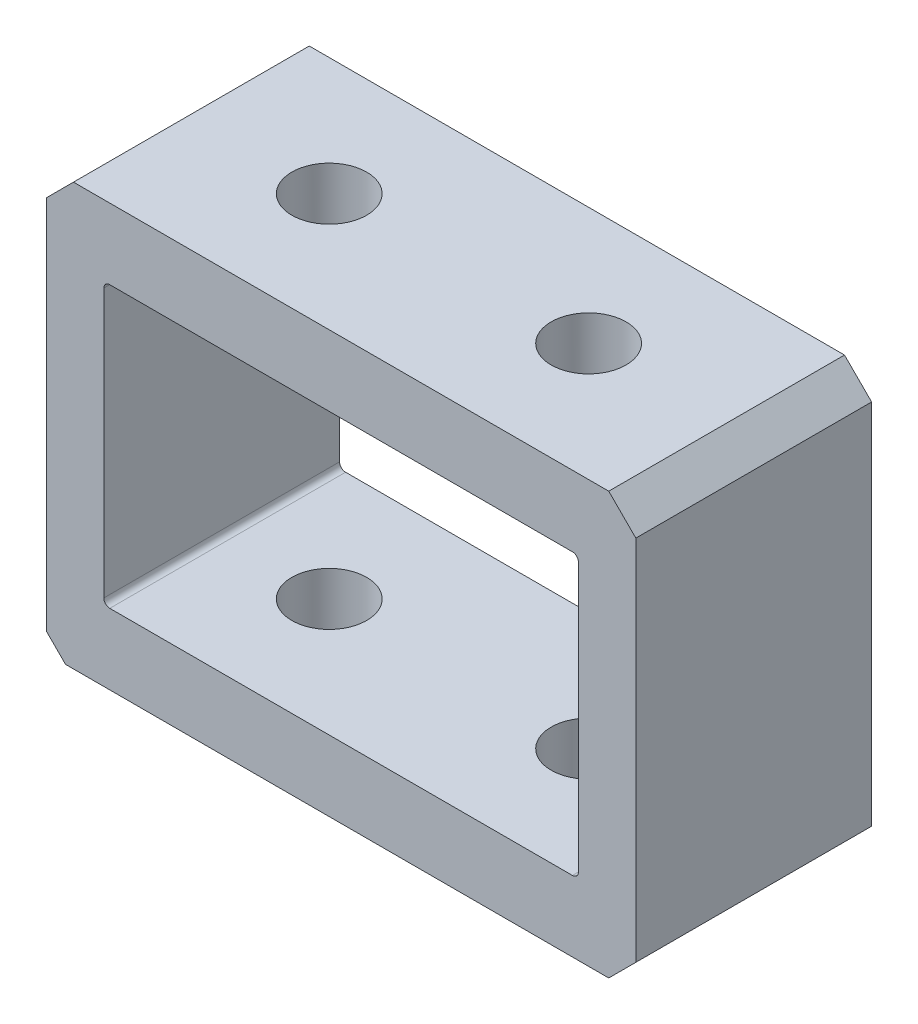
ISO-10303-21;
HEADER;
FILE_DESCRIPTION(('STEP AP214'),'2;1');
FILE_NAME('part.step','',(''),(''),'','','');
FILE_SCHEMA(('AUTOMOTIVE_DESIGN { 1 0 10303 214 1 1 1 1 }'));
ENDSEC;
DATA;
#1=APPLICATION_CONTEXT('core data for automotive mechanical design processes');
#2=APPLICATION_PROTOCOL_DEFINITION('international standard','automotive_design',2000,#1);
#3=PRODUCT_CONTEXT('',#1,'mechanical');
#4=PRODUCT('Part','Part','',(#3));
#5=PRODUCT_RELATED_PRODUCT_CATEGORY('part','',(#4));
#6=PRODUCT_DEFINITION_FORMATION('','',#4);
#7=PRODUCT_DEFINITION_CONTEXT('part definition',#1,'design');
#8=PRODUCT_DEFINITION('design','',#6,#7);
#9=PRODUCT_DEFINITION_SHAPE('','',#8);
#10=(LENGTH_UNIT() NAMED_UNIT(*) SI_UNIT(.MILLI.,.METRE.));
#11=(NAMED_UNIT(*) PLANE_ANGLE_UNIT() SI_UNIT($,.RADIAN.));
#12=(NAMED_UNIT(*) SI_UNIT($,.STERADIAN.) SOLID_ANGLE_UNIT());
#13=UNCERTAINTY_MEASURE_WITH_UNIT(LENGTH_MEASURE(1.E-05),#10,'distance_accuracy_value','');
#14=(GEOMETRIC_REPRESENTATION_CONTEXT(3) GLOBAL_UNCERTAINTY_ASSIGNED_CONTEXT((#13)) GLOBAL_UNIT_ASSIGNED_CONTEXT((#10,
#11,#12)) REPRESENTATION_CONTEXT('',''));
#15=CARTESIAN_POINT('',(0.,0.,0.));
#16=DIRECTION('',(0.,0.,1.));
#17=DIRECTION('',(1.,0.,0.));
#18=AXIS2_PLACEMENT_3D('',#15,#16,#17);
#19=CARTESIAN_POINT('',(-12.5,8.9408,10.));
#20=DIRECTION('',(0.,-1.,0.));
#21=DIRECTION('',(0.,0.,-1.));
#22=AXIS2_PLACEMENT_3D('',#19,#20,#21);
#23=PLANE('',#22);
#24=CARTESIAN_POINT('',(-5.50318075502607,8.9408,5.));
#25=DIRECTION('',(0.,-1.,0.));
#26=DIRECTION('',(0.,0.,-1.));
#27=AXIS2_PLACEMENT_3D('',#24,#25,#26);
#28=CIRCLE('',#27,1.5875);
#29=CARTESIAN_POINT('',(-5.50318075502607,8.9408,3.4125));
#30=VERTEX_POINT('',#29);
#31=EDGE_CURVE('E267',#30,#30,#28,.T.);
#32=ORIENTED_EDGE('',*,*,#31,.T.);
#33=EDGE_LOOP('',(#32));
#34=FACE_BOUND('',#33,.T.);
#35=DIRECTION('',(-1.,0.,0.));
#36=VECTOR('',#35,1.);
#37=CARTESIAN_POINT('',(-12.5,8.9408,10.));
#38=LINE('',#37,#36);
#39=CARTESIAN_POINT('',(11.3505,8.9408,10.));
#40=VERTEX_POINT('',#39);
#41=CARTESIAN_POINT('',(-11.3505,8.9408,10.));
#42=VERTEX_POINT('',#41);
#43=EDGE_CURVE('E298',#40,#42,#38,.T.);
#44=ORIENTED_EDGE('',*,*,#43,.F.);
#45=DIRECTION('',(0.,0.,-1.));
#46=VECTOR('',#45,1.);
#47=CARTESIAN_POINT('',(11.3505,8.9408,10.));
#48=LINE('',#47,#46);
#49=CARTESIAN_POINT('',(11.3505,8.9408,0.));
#50=VERTEX_POINT('',#49);
#51=EDGE_CURVE('E200',#40,#50,#48,.T.);
#52=ORIENTED_EDGE('',*,*,#51,.T.);
#53=DIRECTION('',(-1.,0.,0.));
#54=VECTOR('',#53,1.);
#55=CARTESIAN_POINT('',(-12.5,8.9408,0.));
#56=LINE('',#55,#54);
#57=CARTESIAN_POINT('',(-11.3505,8.9408,0.));
#58=VERTEX_POINT('',#57);
#59=EDGE_CURVE('E168',#50,#58,#56,.T.);
#60=ORIENTED_EDGE('',*,*,#59,.T.);
#61=DIRECTION('',(0.,0.,1.));
#62=VECTOR('',#61,1.);
#63=CARTESIAN_POINT('',(-11.3505,8.9408,10.));
#64=LINE('',#63,#62);
#65=EDGE_CURVE('E195',#58,#42,#64,.T.);
#66=ORIENTED_EDGE('',*,*,#65,.T.);
#67=EDGE_LOOP('',(#44,#52,#60,#66));
#68=FACE_BOUND('',#67,.T.);
#69=CARTESIAN_POINT('',(5.49681924497393,8.9408,5.));
#70=DIRECTION('',(0.,-1.,0.));
#71=DIRECTION('',(0.,0.,-1.));
#72=AXIS2_PLACEMENT_3D('',#69,#70,#71);
#73=CIRCLE('',#72,1.5875);
#74=CARTESIAN_POINT('',(5.49681924497393,8.9408,3.4125));
#75=VERTEX_POINT('',#74);
#76=EDGE_CURVE('E251',#75,#75,#73,.F.);
#77=ORIENTED_EDGE('',*,*,#76,.F.);
#78=EDGE_LOOP('',(#77));
#79=FACE_BOUND('',#78,.T.);
#80=ADVANCED_FACE('F40',(#34,#68,#79),#23,.F.);
#81=CARTESIAN_POINT('',(-12.5,-8.9408,10.));
#82=DIRECTION('',(0.,1.,0.));
#83=DIRECTION('',(0.,0.,1.));
#84=AXIS2_PLACEMENT_3D('',#81,#82,#83);
#85=PLANE('',#84);
#86=CARTESIAN_POINT('',(-5.50318075502607,-8.9408,5.));
#87=DIRECTION('',(0.,-1.,0.));
#88=DIRECTION('',(0.,0.,-1.));
#89=AXIS2_PLACEMENT_3D('',#86,#87,#88);
#90=CIRCLE('',#89,1.5875);
#91=CARTESIAN_POINT('',(-5.50318075502607,-8.9408,3.4125));
#92=VERTEX_POINT('',#91);
#93=EDGE_CURVE('E262',#92,#92,#90,.T.);
#94=ORIENTED_EDGE('',*,*,#93,.F.);
#95=EDGE_LOOP('',(#94));
#96=FACE_BOUND('',#95,.T.);
#97=DIRECTION('',(1.,0.,0.));
#98=VECTOR('',#97,1.);
#99=CARTESIAN_POINT('',(-12.5,-8.9408,0.));
#100=LINE('',#99,#98);
#101=CARTESIAN_POINT('',(-11.6871807550261,-8.9408,0.));
#102=VERTEX_POINT('',#101);
#103=CARTESIAN_POINT('',(11.3505,-8.9408,0.));
#104=VERTEX_POINT('',#103);
#105=EDGE_CURVE('E167',#102,#104,#100,.T.);
#106=ORIENTED_EDGE('',*,*,#105,.T.);
#107=DIRECTION('',(0.,0.,1.));
#108=VECTOR('',#107,1.);
#109=CARTESIAN_POINT('',(11.3505,-8.9408,10.));
#110=LINE('',#109,#108);
#111=CARTESIAN_POINT('',(11.3505,-8.9408,10.));
#112=VERTEX_POINT('',#111);
#113=EDGE_CURVE('E216',#104,#112,#110,.T.);
#114=ORIENTED_EDGE('',*,*,#113,.T.);
#115=DIRECTION('',(1.,0.,0.));
#116=VECTOR('',#115,1.);
#117=CARTESIAN_POINT('',(-12.5,-8.9408,10.));
#118=LINE('',#117,#116);
#119=CARTESIAN_POINT('',(-11.6871807550261,-8.9408,10.));
#120=VERTEX_POINT('',#119);
#121=EDGE_CURVE('E183',#120,#112,#118,.T.);
#122=ORIENTED_EDGE('',*,*,#121,.F.);
#123=DIRECTION('',(0.,0.,-1.));
#124=VECTOR('',#123,1.);
#125=CARTESIAN_POINT('',(-11.6871807550261,-8.9408,10.));
#126=LINE('',#125,#124);
#127=EDGE_CURVE('E179',#120,#102,#126,.T.);
#128=ORIENTED_EDGE('',*,*,#127,.T.);
#129=EDGE_LOOP('',(#106,#114,#122,#128));
#130=FACE_BOUND('',#129,.T.);
#131=CARTESIAN_POINT('',(5.49681924497393,-8.9408,5.));
#132=DIRECTION('',(0.,-1.,0.));
#133=DIRECTION('',(0.,0.,-1.));
#134=AXIS2_PLACEMENT_3D('',#131,#132,#133);
#135=CIRCLE('',#134,1.5875);
#136=CARTESIAN_POINT('',(5.49681924497393,-8.9408,3.4125));
#137=VERTEX_POINT('',#136);
#138=EDGE_CURVE('E257',#137,#137,#135,.F.);
#139=ORIENTED_EDGE('',*,*,#138,.T.);
#140=EDGE_LOOP('',(#139));
#141=FACE_BOUND('',#140,.T.);
#142=ADVANCED_FACE('F327',(#96,#130,#141),#85,.F.);
#143=CARTESIAN_POINT('',(-10.06475,-5.9435,0.));
#144=DIRECTION('',(0.,-1.,0.));
#145=DIRECTION('',(0.,0.,-1.));
#146=AXIS2_PLACEMENT_3D('',#143,#144,#145);
#147=PLANE('',#146);
#148=CARTESIAN_POINT('',(-5.50318075502607,-5.9435,5.));
#149=DIRECTION('',(0.,-1.,0.));
#150=DIRECTION('',(0.,0.,-1.));
#151=AXIS2_PLACEMENT_3D('',#148,#149,#150);
#152=CIRCLE('',#151,1.5875);
#153=CARTESIAN_POINT('',(-5.50318075502607,-5.9435,3.4125));
#154=VERTEX_POINT('',#153);
#155=EDGE_CURVE('E250',#154,#154,#152,.T.);
#156=ORIENTED_EDGE('',*,*,#155,.T.);
#157=EDGE_LOOP('',(#156));
#158=FACE_BOUND('',#157,.T.);
#159=DIRECTION('',(1.,0.,0.));
#160=VECTOR('',#159,1.);
#161=CARTESIAN_POINT('',(-10.06475,-5.9435,10.));
#162=LINE('',#161,#160);
#163=CARTESIAN_POINT('',(-9.81075,-5.9435,10.));
#164=VERTEX_POINT('',#163);
#165=CARTESIAN_POINT('',(9.81075,-5.9435,10.));
#166=VERTEX_POINT('',#165);
#167=EDGE_CURVE('E277',#164,#166,#162,.T.);
#168=ORIENTED_EDGE('',*,*,#167,.T.);
#169=DIRECTION('',(0.,0.,1.));
#170=VECTOR('',#169,1.);
#171=CARTESIAN_POINT('',(9.81075,-5.9435,0.));
#172=LINE('',#171,#170);
#173=CARTESIAN_POINT('',(9.81075,-5.9435,0.));
#174=VERTEX_POINT('',#173);
#175=EDGE_CURVE('E226',#166,#174,#172,.F.);
#176=ORIENTED_EDGE('',*,*,#175,.T.);
#177=DIRECTION('',(1.,0.,0.));
#178=VECTOR('',#177,1.);
#179=CARTESIAN_POINT('',(-10.06475,-5.9435,0.));
#180=LINE('',#179,#178);
#181=CARTESIAN_POINT('',(-9.81075,-5.9435,0.));
#182=VERTEX_POINT('',#181);
#183=EDGE_CURVE('E282',#182,#174,#180,.T.);
#184=ORIENTED_EDGE('',*,*,#183,.F.);
#185=DIRECTION('',(0.,0.,1.));
#186=VECTOR('',#185,1.);
#187=CARTESIAN_POINT('',(-9.81075,-5.9435,10.));
#188=LINE('',#187,#186);
#189=EDGE_CURVE('E223',#182,#164,#188,.T.);
#190=ORIENTED_EDGE('',*,*,#189,.T.);
#191=EDGE_LOOP('',(#168,#176,#184,#190));
#192=FACE_BOUND('',#191,.T.);
#193=CARTESIAN_POINT('',(5.49681924497393,-5.9435,5.));
#194=DIRECTION('',(0.,-1.,0.));
#195=DIRECTION('',(0.,0.,-1.));
#196=AXIS2_PLACEMENT_3D('',#193,#194,#195);
#197=CIRCLE('',#196,1.5875);
#198=CARTESIAN_POINT('',(5.49681924497393,-5.9435,3.4125));
#199=VERTEX_POINT('',#198);
#200=EDGE_CURVE('E270',#199,#199,#197,.F.);
#201=ORIENTED_EDGE('',*,*,#200,.F.);
#202=EDGE_LOOP('',(#201));
#203=FACE_BOUND('',#202,.T.);
#204=ADVANCED_FACE('F331',(#158,#192,#203),#147,.F.);
#205=CARTESIAN_POINT('',(-10.06475,5.9435,0.));
#206=DIRECTION('',(0.,1.,0.));
#207=DIRECTION('',(0.,0.,1.));
#208=AXIS2_PLACEMENT_3D('',#205,#206,#207);
#209=PLANE('',#208);
#210=CARTESIAN_POINT('',(-5.50318075502607,5.9435,5.));
#211=DIRECTION('',(0.,1.,0.));
#212=DIRECTION('',(0.,0.,1.));
#213=AXIS2_PLACEMENT_3D('',#210,#211,#212);
#214=CIRCLE('',#213,1.5875);
#215=CARTESIAN_POINT('',(-5.50318075502607,5.9435,6.5875));
#216=VERTEX_POINT('',#215);
#217=EDGE_CURVE('E248',#216,#216,#214,.T.);
#218=ORIENTED_EDGE('',*,*,#217,.T.);
#219=EDGE_LOOP('',(#218));
#220=FACE_BOUND('',#219,.T.);
#221=DIRECTION('',(-1.,0.,0.));
#222=VECTOR('',#221,1.);
#223=CARTESIAN_POINT('',(-10.06475,5.9435,0.));
#224=LINE('',#223,#222);
#225=CARTESIAN_POINT('',(9.81075,5.9435,0.));
#226=VERTEX_POINT('',#225);
#227=CARTESIAN_POINT('',(-9.81075,5.9435,0.));
#228=VERTEX_POINT('',#227);
#229=EDGE_CURVE('E276',#226,#228,#224,.T.);
#230=ORIENTED_EDGE('',*,*,#229,.F.);
#231=DIRECTION('',(0.,0.,1.));
#232=VECTOR('',#231,1.);
#233=CARTESIAN_POINT('',(9.81075,5.9435,10.));
#234=LINE('',#233,#232);
#235=CARTESIAN_POINT('',(9.81075,5.9435,10.));
#236=VERTEX_POINT('',#235);
#237=EDGE_CURVE('E234',#226,#236,#234,.T.);
#238=ORIENTED_EDGE('',*,*,#237,.T.);
#239=DIRECTION('',(-1.,0.,0.));
#240=VECTOR('',#239,1.);
#241=CARTESIAN_POINT('',(-10.06475,5.9435,10.));
#242=LINE('',#241,#240);
#243=CARTESIAN_POINT('',(-9.81075,5.9435,10.));
#244=VERTEX_POINT('',#243);
#245=EDGE_CURVE('E288',#236,#244,#242,.T.);
#246=ORIENTED_EDGE('',*,*,#245,.T.);
#247=DIRECTION('',(0.,0.,1.));
#248=VECTOR('',#247,1.);
#249=CARTESIAN_POINT('',(-9.81075,5.9435,0.));
#250=LINE('',#249,#248);
#251=EDGE_CURVE('E57',#244,#228,#250,.F.);
#252=ORIENTED_EDGE('',*,*,#251,.T.);
#253=EDGE_LOOP('',(#230,#238,#246,#252));
#254=FACE_BOUND('',#253,.T.);
#255=CARTESIAN_POINT('',(5.49681924497393,5.9435,5.));
#256=DIRECTION('',(0.,1.,0.));
#257=DIRECTION('',(0.,0.,1.));
#258=AXIS2_PLACEMENT_3D('',#255,#256,#257);
#259=CIRCLE('',#258,1.5875);
#260=CARTESIAN_POINT('',(5.49681924497393,5.9435,6.5875));
#261=VERTEX_POINT('',#260);
#262=EDGE_CURVE('E44',#261,#261,#259,.F.);
#263=ORIENTED_EDGE('',*,*,#262,.F.);
#264=EDGE_LOOP('',(#263));
#265=FACE_BOUND('',#264,.T.);
#266=ADVANCED_FACE('F345',(#220,#254,#265),#209,.F.);
#267=CARTESIAN_POINT('',(-12.5,-8.12798075502606,10.));
#268=DIRECTION('',(0.707106781186547,0.707106781186547,0.));
#269=DIRECTION('',(0.,0.,1.));
#270=AXIS2_PLACEMENT_3D('',#267,#268,#269);
#271=PLANE('',#270);
#272=DIRECTION('',(0.,0.,1.));
#273=VECTOR('',#272,1.);
#274=CARTESIAN_POINT('',(-12.5,-8.12798075502606,10.));
#275=LINE('',#274,#273);
#276=CARTESIAN_POINT('',(-12.5,-8.12798075502606,0.));
#277=VERTEX_POINT('',#276);
#278=CARTESIAN_POINT('',(-12.5,-8.12798075502606,10.));
#279=VERTEX_POINT('',#278);
#280=EDGE_CURVE('E162',#277,#279,#275,.T.);
#281=ORIENTED_EDGE('',*,*,#280,.F.);
#282=DIRECTION('',(0.707106781186548,-0.707106781186548,0.));
#283=VECTOR('',#282,1.);
#284=CARTESIAN_POINT('',(-12.5,-8.12798075502606,0.));
#285=LINE('',#284,#283);
#286=EDGE_CURVE('E171',#102,#277,#285,.F.);
#287=ORIENTED_EDGE('',*,*,#286,.F.);
#288=ORIENTED_EDGE('',*,*,#127,.F.);
#289=DIRECTION('',(-0.707106781186548,0.707106781186548,0.));
#290=VECTOR('',#289,1.);
#291=CARTESIAN_POINT('',(-10.313990377513,-10.313990377513,10.));
#292=LINE('',#291,#290);
#293=EDGE_CURVE('E178',#279,#120,#292,.F.);
#294=ORIENTED_EDGE('',*,*,#293,.F.);
#295=EDGE_LOOP('',(#281,#287,#288,#294));
#296=FACE_BOUND('',#295,.T.);
#297=ADVANCED_FACE('F182',(#296),#271,.F.);
#298=CARTESIAN_POINT('',(12.5,8.9408,10.));
#299=DIRECTION('',(-1.,0.,0.));
#300=DIRECTION('',(0.,-1.,0.));
#301=AXIS2_PLACEMENT_3D('',#298,#299,#300);
#302=PLANE('',#301);
#303=DIRECTION('',(0.,1.,0.));
#304=VECTOR('',#303,1.);
#305=CARTESIAN_POINT('',(12.5,8.9408,0.));
#306=LINE('',#305,#304);
#307=CARTESIAN_POINT('',(12.5,-7.7913,0.));
#308=VERTEX_POINT('',#307);
#309=CARTESIAN_POINT('',(12.5,7.79129999999999,0.));
#310=VERTEX_POINT('',#309);
#311=EDGE_CURVE('E285',#308,#310,#306,.T.);
#312=ORIENTED_EDGE('',*,*,#311,.T.);
#313=DIRECTION('',(0.,0.,1.));
#314=VECTOR('',#313,1.);
#315=CARTESIAN_POINT('',(12.5,7.79129999999999,10.));
#316=LINE('',#315,#314);
#317=CARTESIAN_POINT('',(12.5,7.79129999999999,10.));
#318=VERTEX_POINT('',#317);
#319=EDGE_CURVE('E210',#310,#318,#316,.T.);
#320=ORIENTED_EDGE('',*,*,#319,.T.);
#321=DIRECTION('',(0.,1.,0.));
#322=VECTOR('',#321,1.);
#323=CARTESIAN_POINT('',(12.5,8.9408,10.));
#324=LINE('',#323,#322);
#325=CARTESIAN_POINT('',(12.5,-7.7913,10.));
#326=VERTEX_POINT('',#325);
#327=EDGE_CURVE('E295',#326,#318,#324,.T.);
#328=ORIENTED_EDGE('',*,*,#327,.F.);
#329=DIRECTION('',(0.,0.,-1.));
#330=VECTOR('',#329,1.);
#331=CARTESIAN_POINT('',(12.5,-7.7913,10.));
#332=LINE('',#331,#330);
#333=EDGE_CURVE('E207',#326,#308,#332,.T.);
#334=ORIENTED_EDGE('',*,*,#333,.T.);
#335=EDGE_LOOP('',(#312,#320,#328,#334));
#336=FACE_BOUND('',#335,.T.);
#337=ADVANCED_FACE('F319',(#336),#302,.F.);
#338=CARTESIAN_POINT('',(-12.5,8.9408,10.));
#339=DIRECTION('',(1.,0.,0.));
#340=DIRECTION('',(0.,0.,-1.));
#341=AXIS2_PLACEMENT_3D('',#338,#339,#340);
#342=PLANE('',#341);
#343=DIRECTION('',(0.,-1.,0.));
#344=VECTOR('',#343,1.);
#345=CARTESIAN_POINT('',(-12.5,8.9408,10.));
#346=LINE('',#345,#344);
#347=CARTESIAN_POINT('',(-12.5,7.7913,10.));
#348=VERTEX_POINT('',#347);
#349=EDGE_CURVE('E187',#348,#279,#346,.T.);
#350=ORIENTED_EDGE('',*,*,#349,.F.);
#351=DIRECTION('',(0.,0.,-1.));
#352=VECTOR('',#351,1.);
#353=CARTESIAN_POINT('',(-12.5,7.7913,10.));
#354=LINE('',#353,#352);
#355=CARTESIAN_POINT('',(-12.5,7.7913,0.));
#356=VERTEX_POINT('',#355);
#357=EDGE_CURVE('E164',#348,#356,#354,.T.);
#358=ORIENTED_EDGE('',*,*,#357,.T.);
#359=DIRECTION('',(0.,-1.,0.));
#360=VECTOR('',#359,1.);
#361=CARTESIAN_POINT('',(-12.5,8.9408,0.));
#362=LINE('',#361,#360);
#363=EDGE_CURVE('E157',#356,#277,#362,.T.);
#364=ORIENTED_EDGE('',*,*,#363,.T.);
#365=ORIENTED_EDGE('',*,*,#280,.T.);
#366=EDGE_LOOP('',(#350,#358,#364,#365));
#367=FACE_BOUND('',#366,.T.);
#368=ADVANCED_FACE('F160',(#367),#342,.F.);
#369=CARTESIAN_POINT('',(0.,0.,10.));
#370=DIRECTION('',(0.,0.,1.));
#371=DIRECTION('',(1.,0.,0.));
#372=AXIS2_PLACEMENT_3D('',#369,#370,#371);
#373=PLANE('',#372);
#374=DIRECTION('',(0.,1.,0.));
#375=VECTOR('',#374,1.);
#376=CARTESIAN_POINT('',(10.06475,5.9435,10.));
#377=LINE('',#376,#375);
#378=CARTESIAN_POINT('',(10.06475,-5.6895,10.));
#379=VERTEX_POINT('',#378);
#380=CARTESIAN_POINT('',(10.06475,5.6895,10.));
#381=VERTEX_POINT('',#380);
#382=EDGE_CURVE('E273',#379,#381,#377,.T.);
#383=ORIENTED_EDGE('',*,*,#382,.F.);
#384=CARTESIAN_POINT('',(9.81075,-5.6895,10.));
#385=DIRECTION('',(0.,0.,1.));
#386=DIRECTION('',(1.,0.,0.));
#387=AXIS2_PLACEMENT_3D('',#384,#385,#386);
#388=CIRCLE('',#387,0.254);
#389=EDGE_CURVE('E237',#379,#166,#388,.F.);
#390=ORIENTED_EDGE('',*,*,#389,.T.);
#391=ORIENTED_EDGE('',*,*,#167,.F.);
#392=CARTESIAN_POINT('',(-9.81075,-5.6895,10.));
#393=DIRECTION('',(0.,0.,1.));
#394=DIRECTION('',(1.,0.,0.));
#395=AXIS2_PLACEMENT_3D('',#392,#393,#394);
#396=CIRCLE('',#395,0.254);
#397=CARTESIAN_POINT('',(-10.06475,-5.6895,10.));
#398=VERTEX_POINT('',#397);
#399=EDGE_CURVE('E241',#164,#398,#396,.F.);
#400=ORIENTED_EDGE('',*,*,#399,.T.);
#401=DIRECTION('',(0.,-1.,0.));
#402=VECTOR('',#401,1.);
#403=CARTESIAN_POINT('',(-10.06475,5.9435,10.));
#404=LINE('',#403,#402);
#405=CARTESIAN_POINT('',(-10.06475,5.6895,10.));
#406=VERTEX_POINT('',#405);
#407=EDGE_CURVE('E290',#406,#398,#404,.T.);
#408=ORIENTED_EDGE('',*,*,#407,.F.);
#409=CARTESIAN_POINT('',(-9.81075,5.6895,10.));
#410=DIRECTION('',(0.,0.,1.));
#411=DIRECTION('',(1.,0.,0.));
#412=AXIS2_PLACEMENT_3D('',#409,#410,#411);
#413=CIRCLE('',#412,0.254);
#414=EDGE_CURVE('E49',#406,#244,#413,.F.);
#415=ORIENTED_EDGE('',*,*,#414,.T.);
#416=ORIENTED_EDGE('',*,*,#245,.F.);
#417=CARTESIAN_POINT('',(9.81075,5.6895,10.));
#418=DIRECTION('',(0.,0.,1.));
#419=DIRECTION('',(1.,0.,0.));
#420=AXIS2_PLACEMENT_3D('',#417,#418,#419);
#421=CIRCLE('',#420,0.254);
#422=EDGE_CURVE('E245',#236,#381,#421,.F.);
#423=ORIENTED_EDGE('',*,*,#422,.T.);
#424=EDGE_LOOP('',(#383,#390,#391,#400,#408,#415,#416,#423));
#425=FACE_BOUND('',#424,.T.);
#426=ORIENTED_EDGE('',*,*,#327,.T.);
#427=DIRECTION('',(0.707106781186545,-0.70710678118655,0.));
#428=VECTOR('',#427,1.);
#429=CARTESIAN_POINT('',(10.14565,10.14565,10.));
#430=LINE('',#429,#428);
#431=EDGE_CURVE('E214',#318,#40,#430,.F.);
#432=ORIENTED_EDGE('',*,*,#431,.T.);
#433=ORIENTED_EDGE('',*,*,#43,.T.);
#434=DIRECTION('',(0.70710678118655,0.707106781186545,0.));
#435=VECTOR('',#434,1.);
#436=CARTESIAN_POINT('',(-10.14565,10.14565,10.));
#437=LINE('',#436,#435);
#438=EDGE_CURVE('E198',#42,#348,#437,.F.);
#439=ORIENTED_EDGE('',*,*,#438,.T.);
#440=ORIENTED_EDGE('',*,*,#349,.T.);
#441=ORIENTED_EDGE('',*,*,#293,.T.);
#442=ORIENTED_EDGE('',*,*,#121,.T.);
#443=DIRECTION('',(-0.707106781186549,-0.707106781186546,0.));
#444=VECTOR('',#443,1.);
#445=CARTESIAN_POINT('',(10.14565,-10.14565,10.));
#446=LINE('',#445,#444);
#447=EDGE_CURVE('E212',#112,#326,#446,.F.);
#448=ORIENTED_EDGE('',*,*,#447,.T.);
#449=EDGE_LOOP('',(#426,#432,#433,#439,#440,#441,#442,#448));
#450=FACE_BOUND('',#449,.T.);
#451=ADVANCED_FACE('F312',(#425,#450),#373,.T.);
#452=CARTESIAN_POINT('',(0.,0.,0.));
#453=DIRECTION('',(0.,0.,1.));
#454=DIRECTION('',(1.,0.,0.));
#455=AXIS2_PLACEMENT_3D('',#452,#453,#454);
#456=PLANE('',#455);
#457=DIRECTION('',(0.,-1.,0.));
#458=VECTOR('',#457,1.);
#459=CARTESIAN_POINT('',(-10.06475,5.9435,0.));
#460=LINE('',#459,#458);
#461=CARTESIAN_POINT('',(-10.06475,5.6895,0.));
#462=VERTEX_POINT('',#461);
#463=CARTESIAN_POINT('',(-10.06475,-5.6895,0.));
#464=VERTEX_POINT('',#463);
#465=EDGE_CURVE('E279',#462,#464,#460,.T.);
#466=ORIENTED_EDGE('',*,*,#465,.T.);
#467=CARTESIAN_POINT('',(-9.81075,-5.6895,0.));
#468=DIRECTION('',(0.,0.,1.));
#469=DIRECTION('',(1.,0.,0.));
#470=AXIS2_PLACEMENT_3D('',#467,#468,#469);
#471=CIRCLE('',#470,0.254);
#472=EDGE_CURVE('E243',#464,#182,#471,.T.);
#473=ORIENTED_EDGE('',*,*,#472,.T.);
#474=ORIENTED_EDGE('',*,*,#183,.T.);
#475=CARTESIAN_POINT('',(9.81075,-5.6895,0.));
#476=DIRECTION('',(0.,0.,1.));
#477=DIRECTION('',(1.,0.,0.));
#478=AXIS2_PLACEMENT_3D('',#475,#476,#477);
#479=CIRCLE('',#478,0.254);
#480=CARTESIAN_POINT('',(10.06475,-5.6895,0.));
#481=VERTEX_POINT('',#480);
#482=EDGE_CURVE('E239',#174,#481,#479,.T.);
#483=ORIENTED_EDGE('',*,*,#482,.T.);
#484=DIRECTION('',(0.,1.,0.));
#485=VECTOR('',#484,1.);
#486=CARTESIAN_POINT('',(10.06475,5.9435,0.));
#487=LINE('',#486,#485);
#488=CARTESIAN_POINT('',(10.06475,5.6895,0.));
#489=VERTEX_POINT('',#488);
#490=EDGE_CURVE('E274',#481,#489,#487,.T.);
#491=ORIENTED_EDGE('',*,*,#490,.T.);
#492=CARTESIAN_POINT('',(9.81075,5.6895,0.));
#493=DIRECTION('',(0.,0.,1.));
#494=DIRECTION('',(1.,0.,0.));
#495=AXIS2_PLACEMENT_3D('',#492,#493,#494);
#496=CIRCLE('',#495,0.254);
#497=EDGE_CURVE('E64',#489,#226,#496,.T.);
#498=ORIENTED_EDGE('',*,*,#497,.T.);
#499=ORIENTED_EDGE('',*,*,#229,.T.);
#500=CARTESIAN_POINT('',(-9.81075,5.6895,0.));
#501=DIRECTION('',(0.,0.,1.));
#502=DIRECTION('',(1.,0.,0.));
#503=AXIS2_PLACEMENT_3D('',#500,#501,#502);
#504=CIRCLE('',#503,0.254);
#505=EDGE_CURVE('E13',#228,#462,#504,.T.);
#506=ORIENTED_EDGE('',*,*,#505,.T.);
#507=EDGE_LOOP('',(#466,#473,#474,#483,#491,#498,#499,#506));
#508=FACE_BOUND('',#507,.T.);
#509=ORIENTED_EDGE('',*,*,#59,.F.);
#510=DIRECTION('',(-0.707106781186545,0.70710678118655,0.));
#511=VECTOR('',#510,1.);
#512=CARTESIAN_POINT('',(11.3505,8.9408,0.));
#513=LINE('',#512,#511);
#514=EDGE_CURVE('E205',#50,#310,#513,.F.);
#515=ORIENTED_EDGE('',*,*,#514,.T.);
#516=ORIENTED_EDGE('',*,*,#311,.F.);
#517=DIRECTION('',(0.707106781186549,0.707106781186546,0.));
#518=VECTOR('',#517,1.);
#519=CARTESIAN_POINT('',(12.5,-7.7913,0.));
#520=LINE('',#519,#518);
#521=EDGE_CURVE('E203',#308,#104,#520,.F.);
#522=ORIENTED_EDGE('',*,*,#521,.T.);
#523=ORIENTED_EDGE('',*,*,#105,.F.);
#524=ORIENTED_EDGE('',*,*,#286,.T.);
#525=ORIENTED_EDGE('',*,*,#363,.F.);
#526=DIRECTION('',(-0.70710678118655,-0.707106781186545,0.));
#527=VECTOR('',#526,1.);
#528=CARTESIAN_POINT('',(-12.5,7.7913,0.));
#529=LINE('',#528,#527);
#530=EDGE_CURVE('E193',#356,#58,#529,.F.);
#531=ORIENTED_EDGE('',*,*,#530,.T.);
#532=EDGE_LOOP('',(#509,#515,#516,#522,#523,#524,#525,#531));
#533=FACE_BOUND('',#532,.T.);
#534=ADVANCED_FACE('F173',(#508,#533),#456,.F.);
#535=CARTESIAN_POINT('',(-12.5,7.7913,10.));
#536=DIRECTION('',(0.707106781186545,-0.70710678118655,0.));
#537=DIRECTION('',(0.,0.,-1.));
#538=AXIS2_PLACEMENT_3D('',#535,#536,#537);
#539=PLANE('',#538);
#540=ORIENTED_EDGE('',*,*,#438,.F.);
#541=ORIENTED_EDGE('',*,*,#65,.F.);
#542=ORIENTED_EDGE('',*,*,#530,.F.);
#543=ORIENTED_EDGE('',*,*,#357,.F.);
#544=EDGE_LOOP('',(#540,#541,#542,#543));
#545=FACE_BOUND('',#544,.T.);
#546=ADVANCED_FACE('F310',(#545),#539,.F.);
#547=CARTESIAN_POINT('',(11.3505,8.9408,10.));
#548=DIRECTION('',(-0.70710678118655,-0.707106781186545,0.));
#549=DIRECTION('',(0.,0.,-1.));
#550=AXIS2_PLACEMENT_3D('',#547,#548,#549);
#551=PLANE('',#550);
#552=ORIENTED_EDGE('',*,*,#431,.F.);
#553=ORIENTED_EDGE('',*,*,#319,.F.);
#554=ORIENTED_EDGE('',*,*,#514,.F.);
#555=ORIENTED_EDGE('',*,*,#51,.F.);
#556=EDGE_LOOP('',(#552,#553,#554,#555));
#557=FACE_BOUND('',#556,.T.);
#558=ADVANCED_FACE('F315',(#557),#551,.F.);
#559=CARTESIAN_POINT('',(12.5,-7.7913,10.));
#560=DIRECTION('',(-0.707106781186546,0.707106781186549,0.));
#561=DIRECTION('',(0.,0.,-1.));
#562=AXIS2_PLACEMENT_3D('',#559,#560,#561);
#563=PLANE('',#562);
#564=ORIENTED_EDGE('',*,*,#447,.F.);
#565=ORIENTED_EDGE('',*,*,#113,.F.);
#566=ORIENTED_EDGE('',*,*,#521,.F.);
#567=ORIENTED_EDGE('',*,*,#333,.F.);
#568=EDGE_LOOP('',(#564,#565,#566,#567));
#569=FACE_BOUND('',#568,.T.);
#570=ADVANCED_FACE('F324',(#569),#563,.F.);
#571=CARTESIAN_POINT('',(10.06475,5.9435,0.));
#572=DIRECTION('',(1.,0.,0.));
#573=DIRECTION('',(0.,0.,-1.));
#574=AXIS2_PLACEMENT_3D('',#571,#572,#573);
#575=PLANE('',#574);
#576=ORIENTED_EDGE('',*,*,#490,.F.);
#577=DIRECTION('',(0.,0.,1.));
#578=VECTOR('',#577,1.);
#579=CARTESIAN_POINT('',(10.06475,-5.6895,10.));
#580=LINE('',#579,#578);
#581=EDGE_CURVE('E220',#481,#379,#580,.T.);
#582=ORIENTED_EDGE('',*,*,#581,.T.);
#583=ORIENTED_EDGE('',*,*,#382,.T.);
#584=DIRECTION('',(0.,0.,1.));
#585=VECTOR('',#584,1.);
#586=CARTESIAN_POINT('',(10.06475,5.6895,0.));
#587=LINE('',#586,#585);
#588=EDGE_CURVE('E218',#381,#489,#587,.F.);
#589=ORIENTED_EDGE('',*,*,#588,.T.);
#590=EDGE_LOOP('',(#576,#582,#583,#589));
#591=FACE_BOUND('',#590,.T.);
#592=ADVANCED_FACE('F384',(#591),#575,.F.);
#593=CARTESIAN_POINT('',(-10.06475,5.9435,0.));
#594=DIRECTION('',(-1.,0.,0.));
#595=DIRECTION('',(0.,0.,1.));
#596=AXIS2_PLACEMENT_3D('',#593,#594,#595);
#597=PLANE('',#596);
#598=ORIENTED_EDGE('',*,*,#407,.T.);
#599=DIRECTION('',(0.,0.,1.));
#600=VECTOR('',#599,1.);
#601=CARTESIAN_POINT('',(-10.06475,-5.6895,0.));
#602=LINE('',#601,#600);
#603=EDGE_CURVE('E231',#398,#464,#602,.F.);
#604=ORIENTED_EDGE('',*,*,#603,.T.);
#605=ORIENTED_EDGE('',*,*,#465,.F.);
#606=DIRECTION('',(0.,0.,1.));
#607=VECTOR('',#606,1.);
#608=CARTESIAN_POINT('',(-10.06475,5.6895,10.));
#609=LINE('',#608,#607);
#610=EDGE_CURVE('E228',#462,#406,#609,.T.);
#611=ORIENTED_EDGE('',*,*,#610,.T.);
#612=EDGE_LOOP('',(#598,#604,#605,#611));
#613=FACE_BOUND('',#612,.T.);
#614=ADVANCED_FACE('F389',(#613),#597,.F.);
#615=CARTESIAN_POINT('',(9.81075,-5.6895,0.));
#616=DIRECTION('',(0.,0.,-1.));
#617=DIRECTION('',(-1.,0.,0.));
#618=AXIS2_PLACEMENT_3D('',#615,#616,#617);
#619=CYLINDRICAL_SURFACE('',#618,0.254);
#620=ORIENTED_EDGE('',*,*,#482,.F.);
#621=ORIENTED_EDGE('',*,*,#175,.F.);
#622=ORIENTED_EDGE('',*,*,#389,.F.);
#623=ORIENTED_EDGE('',*,*,#581,.F.);
#624=EDGE_LOOP('',(#620,#621,#622,#623));
#625=FACE_BOUND('',#624,.T.);
#626=ADVANCED_FACE('F385',(#625),#619,.F.);
#627=CARTESIAN_POINT('',(-9.81075,-5.6895,0.));
#628=DIRECTION('',(0.,0.,-1.));
#629=DIRECTION('',(-1.,0.,0.));
#630=AXIS2_PLACEMENT_3D('',#627,#628,#629);
#631=CYLINDRICAL_SURFACE('',#630,0.254);
#632=ORIENTED_EDGE('',*,*,#472,.F.);
#633=ORIENTED_EDGE('',*,*,#603,.F.);
#634=ORIENTED_EDGE('',*,*,#399,.F.);
#635=ORIENTED_EDGE('',*,*,#189,.F.);
#636=EDGE_LOOP('',(#632,#633,#634,#635));
#637=FACE_BOUND('',#636,.T.);
#638=ADVANCED_FACE('F388',(#637),#631,.F.);
#639=CARTESIAN_POINT('',(9.81075,5.6895,0.));
#640=DIRECTION('',(0.,0.,-1.));
#641=DIRECTION('',(-1.,0.,0.));
#642=AXIS2_PLACEMENT_3D('',#639,#640,#641);
#643=CYLINDRICAL_SURFACE('',#642,0.254);
#644=ORIENTED_EDGE('',*,*,#497,.F.);
#645=ORIENTED_EDGE('',*,*,#588,.F.);
#646=ORIENTED_EDGE('',*,*,#422,.F.);
#647=ORIENTED_EDGE('',*,*,#237,.F.);
#648=EDGE_LOOP('',(#644,#645,#646,#647));
#649=FACE_BOUND('',#648,.T.);
#650=ADVANCED_FACE('F392',(#649),#643,.F.);
#651=CARTESIAN_POINT('',(-9.81075,5.6895,0.));
#652=DIRECTION('',(0.,0.,-1.));
#653=DIRECTION('',(-1.,0.,0.));
#654=AXIS2_PLACEMENT_3D('',#651,#652,#653);
#655=CYLINDRICAL_SURFACE('',#654,0.254);
#656=ORIENTED_EDGE('',*,*,#505,.F.);
#657=ORIENTED_EDGE('',*,*,#251,.F.);
#658=ORIENTED_EDGE('',*,*,#414,.F.);
#659=ORIENTED_EDGE('',*,*,#610,.F.);
#660=EDGE_LOOP('',(#656,#657,#658,#659));
#661=FACE_BOUND('',#660,.T.);
#662=ADVANCED_FACE('F42',(#661),#655,.F.);
#663=CARTESIAN_POINT('',(-5.50318075502607,8.9408,5.));
#664=DIRECTION('',(0.,-1.,0.));
#665=DIRECTION('',(0.,0.,-1.));
#666=AXIS2_PLACEMENT_3D('',#663,#664,#665);
#667=CYLINDRICAL_SURFACE('',#666,1.5875);
#668=ORIENTED_EDGE('',*,*,#31,.F.);
#669=EDGE_LOOP('',(#668));
#670=FACE_BOUND('',#669,.T.);
#671=ORIENTED_EDGE('',*,*,#217,.F.);
#672=EDGE_LOOP('',(#671));
#673=FACE_BOUND('',#672,.T.);
#674=ADVANCED_FACE('F399',(#670,#673),#667,.F.);
#675=CARTESIAN_POINT('',(5.49681924497393,8.9408,5.));
#676=DIRECTION('',(0.,-1.,0.));
#677=DIRECTION('',(0.,0.,-1.));
#678=AXIS2_PLACEMENT_3D('',#675,#676,#677);
#679=CYLINDRICAL_SURFACE('',#678,1.5875);
#680=ORIENTED_EDGE('',*,*,#76,.T.);
#681=EDGE_LOOP('',(#680));
#682=FACE_BOUND('',#681,.T.);
#683=ORIENTED_EDGE('',*,*,#262,.T.);
#684=EDGE_LOOP('',(#683));
#685=FACE_BOUND('',#684,.T.);
#686=ADVANCED_FACE('F341',(#682,#685),#679,.F.);
#687=ORIENTED_EDGE('',*,*,#93,.T.);
#688=EDGE_LOOP('',(#687));
#689=FACE_BOUND('',#688,.T.);
#690=ORIENTED_EDGE('',*,*,#155,.F.);
#691=EDGE_LOOP('',(#690));
#692=FACE_BOUND('',#691,.T.);
#693=ADVANCED_FACE('F339',(#689,#692),#667,.F.);
#694=ORIENTED_EDGE('',*,*,#138,.F.);
#695=EDGE_LOOP('',(#694));
#696=FACE_BOUND('',#695,.T.);
#697=ORIENTED_EDGE('',*,*,#200,.T.);
#698=EDGE_LOOP('',(#697));
#699=FACE_BOUND('',#698,.T.);
#700=ADVANCED_FACE('F336',(#696,#699),#679,.F.);
#701=CLOSED_SHELL('',(#80,#142,#204,#266,#297,#337,#368,#451,#534,#546,#558,#570,#592,#614,#626,
#638,#650,#662,#674,#686,#693,#700));
#702=MANIFOLD_SOLID_BREP('B2',#701);
#703=ADVANCED_BREP_SHAPE_REPRESENTATION('',(#18,#702),#14);
#704=SHAPE_DEFINITION_REPRESENTATION(#9,#703);
ENDSEC;
END-ISO-10303-21;
